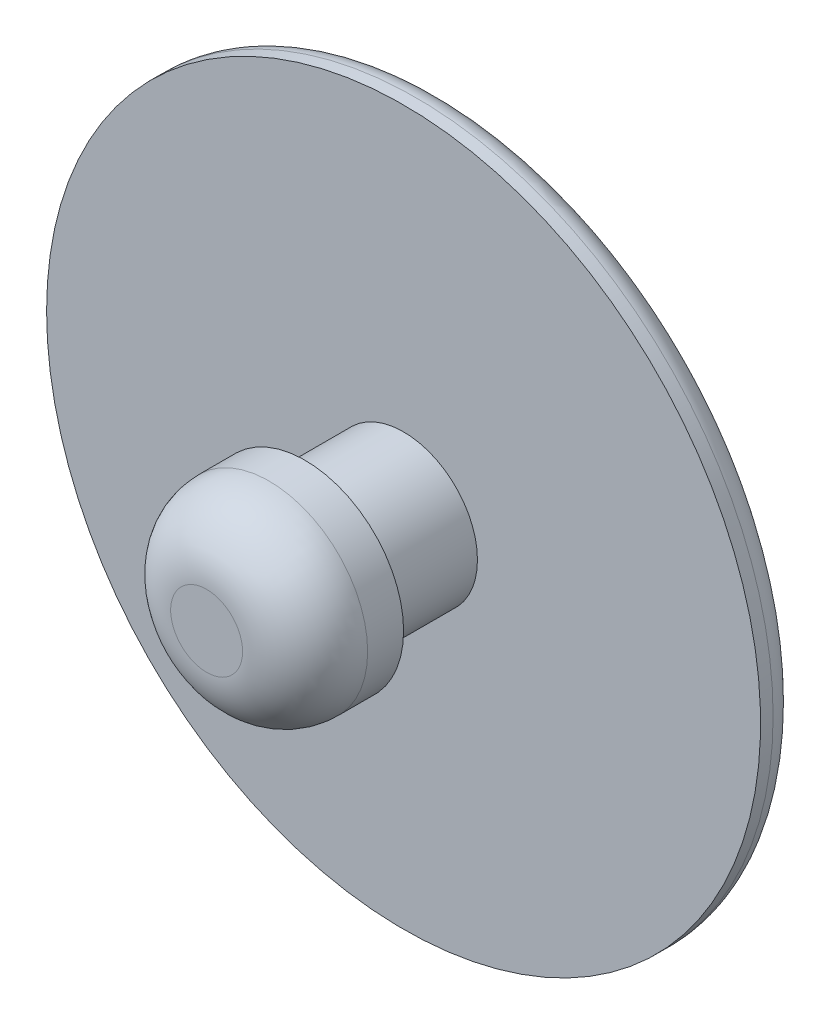
ISO-10303-21;
HEADER;
FILE_DESCRIPTION(('STEP AP214'),'2;1');
FILE_NAME('part.step','',(''),(''),'','','');
FILE_SCHEMA(('AUTOMOTIVE_DESIGN { 1 0 10303 214 1 1 1 1 }'));
ENDSEC;
DATA;
#1=APPLICATION_CONTEXT('core data for automotive mechanical design processes');
#2=APPLICATION_PROTOCOL_DEFINITION('international standard','automotive_design',2000,#1);
#3=PRODUCT_CONTEXT('',#1,'mechanical');
#4=PRODUCT('Part','Part','',(#3));
#5=PRODUCT_RELATED_PRODUCT_CATEGORY('part','',(#4));
#6=PRODUCT_DEFINITION_FORMATION('','',#4);
#7=PRODUCT_DEFINITION_CONTEXT('part definition',#1,'design');
#8=PRODUCT_DEFINITION('design','',#6,#7);
#9=PRODUCT_DEFINITION_SHAPE('','',#8);
#10=(LENGTH_UNIT() NAMED_UNIT(*) SI_UNIT(.MILLI.,.METRE.));
#11=(NAMED_UNIT(*) PLANE_ANGLE_UNIT() SI_UNIT($,.RADIAN.));
#12=(NAMED_UNIT(*) SI_UNIT($,.STERADIAN.) SOLID_ANGLE_UNIT());
#13=UNCERTAINTY_MEASURE_WITH_UNIT(LENGTH_MEASURE(1.E-05),#10,'distance_accuracy_value','');
#14=(GEOMETRIC_REPRESENTATION_CONTEXT(3) GLOBAL_UNCERTAINTY_ASSIGNED_CONTEXT((#13)) GLOBAL_UNIT_ASSIGNED_CONTEXT((#10,
#11,#12)) REPRESENTATION_CONTEXT('',''));
#15=CARTESIAN_POINT('',(0.,0.,0.));
#16=DIRECTION('',(0.,0.,1.));
#17=DIRECTION('',(1.,0.,0.));
#18=AXIS2_PLACEMENT_3D('',#15,#16,#17);
#19=CARTESIAN_POINT('',(0.,0.,0.762));
#20=DIRECTION('',(0.,0.,1.));
#21=DIRECTION('',(1.,0.,0.));
#22=AXIS2_PLACEMENT_3D('',#19,#20,#21);
#23=PLANE('',#22);
#24=CARTESIAN_POINT('',(0.,0.,0.762));
#25=DIRECTION('',(0.,0.,1.));
#26=DIRECTION('',(1.,0.,0.));
#27=AXIS2_PLACEMENT_3D('',#24,#25,#26);
#28=CIRCLE('',#27,7.25);
#29=CARTESIAN_POINT('',(-7.25,0.,0.762));
#30=VERTEX_POINT('',#29);
#31=EDGE_CURVE('E51',#30,#30,#28,.T.);
#32=ORIENTED_EDGE('',*,*,#31,.T.);
#33=EDGE_LOOP('',(#32));
#34=FACE_BOUND('',#33,.T.);
#35=CARTESIAN_POINT('',(0.,0.,0.762));
#36=DIRECTION('',(0.,0.,1.));
#37=DIRECTION('',(1.,0.,0.));
#38=AXIS2_PLACEMENT_3D('',#35,#36,#37);
#39=CIRCLE('',#38,1.5);
#40=CARTESIAN_POINT('',(1.5,0.,0.762));
#41=VERTEX_POINT('',#40);
#42=EDGE_CURVE('E55',#41,#41,#39,.T.);
#43=ORIENTED_EDGE('',*,*,#42,.F.);
#44=EDGE_LOOP('',(#43));
#45=FACE_BOUND('',#44,.T.);
#46=ADVANCED_FACE('F31',(#34,#45),#23,.T.);
#47=CARTESIAN_POINT('',(0.,0.,0.762));
#48=DIRECTION('',(0.,0.,-1.));
#49=DIRECTION('',(-1.,0.,0.));
#50=AXIS2_PLACEMENT_3D('',#47,#48,#49);
#51=CYLINDRICAL_SURFACE('',#50,7.25);
#52=CARTESIAN_POINT('',(0.,0.,0.508));
#53=DIRECTION('',(0.,0.,1.));
#54=DIRECTION('',(1.,0.,0.));
#55=AXIS2_PLACEMENT_3D('',#52,#53,#54);
#56=CIRCLE('',#55,7.25);
#57=CARTESIAN_POINT('',(-7.25,0.,0.508));
#58=VERTEX_POINT('',#57);
#59=EDGE_CURVE('E46',#58,#58,#56,.T.);
#60=CARTESIAN_POINT('',(-7.25,0.,0.508));
#61=CARTESIAN_POINT('',(-7.25,0.,0.510645833333333));
#62=CARTESIAN_POINT('',(-7.25,0.,0.513291666666667));
#63=CARTESIAN_POINT('',(-7.25,0.,0.518583333333333));
#64=CARTESIAN_POINT('',(-7.25,0.,0.521229166666667));
#65=CARTESIAN_POINT('',(-7.25,0.,0.526520833333333));
#66=CARTESIAN_POINT('',(-7.25,0.,0.529166666666667));
#67=CARTESIAN_POINT('',(-7.25,0.,0.534458333333333));
#68=CARTESIAN_POINT('',(-7.25,0.,0.537104166666666));
#69=CARTESIAN_POINT('',(-7.25,0.,0.542395833333333));
#70=CARTESIAN_POINT('',(-7.25,0.,0.545041666666667));
#71=CARTESIAN_POINT('',(-7.25,0.,0.550333333333333));
#72=CARTESIAN_POINT('',(-7.25,0.,0.552979166666667));
#73=CARTESIAN_POINT('',(-7.25,0.,0.558270833333333));
#74=CARTESIAN_POINT('',(-7.25,0.,0.560916666666667));
#75=CARTESIAN_POINT('',(-7.25,0.,0.566208333333333));
#76=CARTESIAN_POINT('',(-7.25,0.,0.568854166666667));
#77=CARTESIAN_POINT('',(-7.25,0.,0.574145833333333));
#78=CARTESIAN_POINT('',(-7.25,0.,0.576791666666666));
#79=CARTESIAN_POINT('',(-7.25,0.,0.582083333333333));
#80=CARTESIAN_POINT('',(-7.25,0.,0.584729166666667));
#81=CARTESIAN_POINT('',(-7.25,0.,0.590020833333333));
#82=CARTESIAN_POINT('',(-7.25,0.,0.592666666666667));
#83=CARTESIAN_POINT('',(-7.25,0.,0.597958333333333));
#84=CARTESIAN_POINT('',(-7.25,0.,0.600604166666667));
#85=CARTESIAN_POINT('',(-7.25,0.,0.605895833333333));
#86=CARTESIAN_POINT('',(-7.25,0.,0.608541666666667));
#87=CARTESIAN_POINT('',(-7.25,0.,0.613833333333333));
#88=CARTESIAN_POINT('',(-7.25,0.,0.616479166666667));
#89=CARTESIAN_POINT('',(-7.25,0.,0.621770833333333));
#90=CARTESIAN_POINT('',(-7.25,0.,0.624416666666667));
#91=CARTESIAN_POINT('',(-7.25,0.,0.629708333333333));
#92=CARTESIAN_POINT('',(-7.25,0.,0.632354166666667));
#93=CARTESIAN_POINT('',(-7.25,0.,0.637645833333333));
#94=CARTESIAN_POINT('',(-7.25,0.,0.640291666666667));
#95=CARTESIAN_POINT('',(-7.25,0.,0.645583333333333));
#96=CARTESIAN_POINT('',(-7.25,0.,0.648229166666667));
#97=CARTESIAN_POINT('',(-7.25,0.,0.653520833333333));
#98=CARTESIAN_POINT('',(-7.25,0.,0.656166666666667));
#99=CARTESIAN_POINT('',(-7.25,0.,0.661458333333333));
#100=CARTESIAN_POINT('',(-7.25,0.,0.664104166666667));
#101=CARTESIAN_POINT('',(-7.25,0.,0.669395833333333));
#102=CARTESIAN_POINT('',(-7.25,0.,0.672041666666667));
#103=CARTESIAN_POINT('',(-7.25,0.,0.677333333333333));
#104=CARTESIAN_POINT('',(-7.25,0.,0.679979166666667));
#105=CARTESIAN_POINT('',(-7.25,0.,0.685270833333333));
#106=CARTESIAN_POINT('',(-7.25,0.,0.687916666666667));
#107=CARTESIAN_POINT('',(-7.25,0.,0.693208333333333));
#108=CARTESIAN_POINT('',(-7.25,0.,0.695854166666667));
#109=CARTESIAN_POINT('',(-7.25,0.,0.701145833333333));
#110=CARTESIAN_POINT('',(-7.25,0.,0.703791666666667));
#111=CARTESIAN_POINT('',(-7.25,0.,0.709083333333333));
#112=CARTESIAN_POINT('',(-7.25,0.,0.711729166666667));
#113=CARTESIAN_POINT('',(-7.25,0.,0.717020833333333));
#114=CARTESIAN_POINT('',(-7.25,0.,0.719666666666667));
#115=CARTESIAN_POINT('',(-7.25,0.,0.724958333333333));
#116=CARTESIAN_POINT('',(-7.25,0.,0.727604166666666));
#117=CARTESIAN_POINT('',(-7.25,0.,0.732895833333333));
#118=CARTESIAN_POINT('',(-7.25,0.,0.735541666666667));
#119=CARTESIAN_POINT('',(-7.25,0.,0.740833333333333));
#120=CARTESIAN_POINT('',(-7.25,0.,0.743479166666667));
#121=CARTESIAN_POINT('',(-7.25,0.,0.748770833333333));
#122=CARTESIAN_POINT('',(-7.25,0.,0.751416666666667));
#123=CARTESIAN_POINT('',(-7.25,0.,0.756708333333333));
#124=CARTESIAN_POINT('',(-7.25,0.,0.759354166666667));
#125=CARTESIAN_POINT('',(-7.25,0.,0.762));
#126=B_SPLINE_CURVE_WITH_KNOTS('',3,(#60,#61,#62,#63,#64,#65,#66,#67,#68,#69,#70,#71,#72,#73,
#74,#75,#76,#77,#78,#79,#80,#81,#82,#83,#84,#85,#86,#87,#88,#89,#90,#91,#92,#93,#94,#95,#96,#97,
#98,#99,#100,#101,#102,#103,#104,#105,#106,#107,#108,#109,#110,#111,#112,#113,#114,#115,#116,
#117,#118,#119,#120,#121,#122,#123,#124,#125),.UNSPECIFIED.,.F.,.F.,(4,2,2,2,2,2,2,2,2,2,2,2,2,
2,2,2,2,2,2,2,2,2,2,2,2,2,2,2,2,2,2,2,4),(0.,0.00793749999999992,0.0158749999999999,0.0238125,
0.0317499999999999,0.0396874999999999,0.0476249999999999,0.0555624999999999,0.0635,
0.0714374999999999,0.0793749999999999,0.0873124999999999,0.09525,0.1031875,0.111125,0.1190625,
0.127,0.1349375,0.142875,0.1508125,0.15875,0.1666875,0.174625,0.1825625,0.1905,0.1984375,
0.206375,0.2143125,0.22225,0.2301875,0.238125,0.2460625,0.254),.UNSPECIFIED.);
#127=EDGE_CURVE('BSEAM80',#58,#30,#126,.T.);
#128=ORIENTED_EDGE('',*,*,#59,.T.);
#129=ORIENTED_EDGE('',*,*,#31,.F.);
#130=ORIENTED_EDGE('',*,*,#127,.T.);
#131=ORIENTED_EDGE('',*,*,#127,.F.);
#132=EDGE_LOOP('',(#128,#130,#129,#131));
#133=FACE_BOUND('',#132,.T.);
#134=ADVANCED_FACE('F80',(#133),#51,.T.);
#135=CARTESIAN_POINT('',(0.,0.,0.));
#136=DIRECTION('',(0.,0.,1.));
#137=DIRECTION('',(1.,0.,0.));
#138=AXIS2_PLACEMENT_3D('',#135,#136,#137);
#139=PLANE('',#138);
#140=CARTESIAN_POINT('',(0.,0.,0.));
#141=DIRECTION('',(0.,0.,1.));
#142=DIRECTION('',(1.,0.,0.));
#143=AXIS2_PLACEMENT_3D('',#140,#141,#142);
#144=CIRCLE('',#143,6.742);
#145=CARTESIAN_POINT('',(6.742,0.,0.));
#146=VERTEX_POINT('',#145);
#147=EDGE_CURVE('E42',#146,#146,#144,.F.);
#148=ORIENTED_EDGE('',*,*,#147,.T.);
#149=EDGE_LOOP('',(#148));
#150=FACE_BOUND('',#149,.T.);
#151=ADVANCED_FACE('F86',(#150),#139,.F.);
#152=CARTESIAN_POINT('',(0.,0.,0.508));
#153=DIRECTION('',(0.,0.,1.));
#154=DIRECTION('',(1.,0.,0.));
#155=AXIS2_PLACEMENT_3D('',#152,#153,#154);
#156=TOROIDAL_SURFACE('',#155,6.742,0.508);
#157=ORIENTED_EDGE('',*,*,#147,.F.);
#158=EDGE_LOOP('',(#157));
#159=FACE_BOUND('',#158,.T.);
#160=ORIENTED_EDGE('',*,*,#59,.F.);
#161=EDGE_LOOP('',(#160));
#162=FACE_BOUND('',#161,.T.);
#163=ADVANCED_FACE('F75',(#159,#162),#156,.T.);
#164=CARTESIAN_POINT('',(0.,0.,2.762));
#165=DIRECTION('',(0.,0.,-1.));
#166=DIRECTION('',(-1.,0.,0.));
#167=AXIS2_PLACEMENT_3D('',#164,#165,#166);
#168=CYLINDRICAL_SURFACE('',#167,1.5);
#169=CARTESIAN_POINT('',(0.,0.,2.762));
#170=DIRECTION('',(0.,0.,1.));
#171=DIRECTION('',(1.,0.,0.));
#172=AXIS2_PLACEMENT_3D('',#169,#170,#171);
#173=CIRCLE('',#172,1.5);
#174=CARTESIAN_POINT('',(1.5,0.,2.762));
#175=VERTEX_POINT('',#174);
#176=EDGE_CURVE('E54',#175,#175,#173,.T.);
#177=ORIENTED_EDGE('',*,*,#176,.F.);
#178=EDGE_LOOP('',(#177));
#179=FACE_BOUND('',#178,.T.);
#180=ORIENTED_EDGE('',*,*,#42,.T.);
#181=EDGE_LOOP('',(#180));
#182=FACE_BOUND('',#181,.T.);
#183=ADVANCED_FACE('F69',(#179,#182),#168,.T.);
#184=CARTESIAN_POINT('',(0.,0.,2.762));
#185=DIRECTION('',(0.,0.,1.));
#186=DIRECTION('',(1.,0.,0.));
#187=AXIS2_PLACEMENT_3D('',#184,#185,#186);
#188=PLANE('',#187);
#189=CARTESIAN_POINT('',(0.,0.,2.762));
#190=DIRECTION('',(0.,0.,1.));
#191=DIRECTION('',(1.,0.,0.));
#192=AXIS2_PLACEMENT_3D('',#189,#190,#191);
#193=CIRCLE('',#192,2.);
#194=CARTESIAN_POINT('',(2.,0.,2.762));
#195=VERTEX_POINT('',#194);
#196=EDGE_CURVE('E58',#195,#195,#193,.T.);
#197=ORIENTED_EDGE('',*,*,#196,.F.);
#198=EDGE_LOOP('',(#197));
#199=FACE_BOUND('',#198,.T.);
#200=ORIENTED_EDGE('',*,*,#176,.T.);
#201=EDGE_LOOP('',(#200));
#202=FACE_BOUND('',#201,.T.);
#203=ADVANCED_FACE('F66',(#199,#202),#188,.F.);
#204=CARTESIAN_POINT('',(0.,0.,4.762));
#205=DIRECTION('',(0.,0.,-1.));
#206=DIRECTION('',(-1.,0.,0.));
#207=AXIS2_PLACEMENT_3D('',#204,#205,#206);
#208=CYLINDRICAL_SURFACE('',#207,2.);
#209=CARTESIAN_POINT('',(0.,0.,3.492));
#210=DIRECTION('',(0.,0.,1.));
#211=DIRECTION('',(1.,0.,0.));
#212=AXIS2_PLACEMENT_3D('',#209,#210,#211);
#213=CIRCLE('',#212,2.);
#214=CARTESIAN_POINT('',(2.,0.,3.492));
#215=VERTEX_POINT('',#214);
#216=EDGE_CURVE('E10',#215,#215,#213,.F.);
#217=ORIENTED_EDGE('',*,*,#216,.T.);
#218=EDGE_LOOP('',(#217));
#219=FACE_BOUND('',#218,.T.);
#220=ORIENTED_EDGE('',*,*,#196,.T.);
#221=EDGE_LOOP('',(#220));
#222=FACE_BOUND('',#221,.T.);
#223=ADVANCED_FACE('F64',(#219,#222),#208,.T.);
#224=CARTESIAN_POINT('',(0.,0.,4.762));
#225=DIRECTION('',(0.,0.,1.));
#226=DIRECTION('',(1.,0.,0.));
#227=AXIS2_PLACEMENT_3D('',#224,#225,#226);
#228=PLANE('',#227);
#229=CARTESIAN_POINT('',(0.,0.,4.762));
#230=DIRECTION('',(0.,0.,1.));
#231=DIRECTION('',(1.,0.,0.));
#232=AXIS2_PLACEMENT_3D('',#229,#230,#231);
#233=CIRCLE('',#232,0.73);
#234=CARTESIAN_POINT('',(0.73,0.,4.762));
#235=VERTEX_POINT('',#234);
#236=EDGE_CURVE('E38',#235,#235,#233,.T.);
#237=ORIENTED_EDGE('',*,*,#236,.T.);
#238=EDGE_LOOP('',(#237));
#239=FACE_BOUND('',#238,.T.);
#240=ADVANCED_FACE('F118',(#239),#228,.T.);
#241=CARTESIAN_POINT('',(0.,0.,3.492));
#242=DIRECTION('',(0.,0.,1.));
#243=DIRECTION('',(1.,0.,0.));
#244=AXIS2_PLACEMENT_3D('',#241,#242,#243);
#245=DEGENERATE_TOROIDAL_SURFACE('',#244,0.73,1.27,.T.);
#246=ORIENTED_EDGE('',*,*,#216,.F.);
#247=EDGE_LOOP('',(#246));
#248=FACE_BOUND('',#247,.T.);
#249=ORIENTED_EDGE('',*,*,#236,.F.);
#250=EDGE_LOOP('',(#249));
#251=FACE_BOUND('',#250,.T.);
#252=ADVANCED_FACE('F33',(#248,#251),#245,.T.);
#253=CLOSED_SHELL('',(#46,#134,#151,#163,#183,#203,#223,#240,#252));
#254=MANIFOLD_SOLID_BREP('B2',#253);
#255=ADVANCED_BREP_SHAPE_REPRESENTATION('',(#18,#254),#14);
#256=SHAPE_DEFINITION_REPRESENTATION(#9,#255);
ENDSEC;
END-ISO-10303-21;
